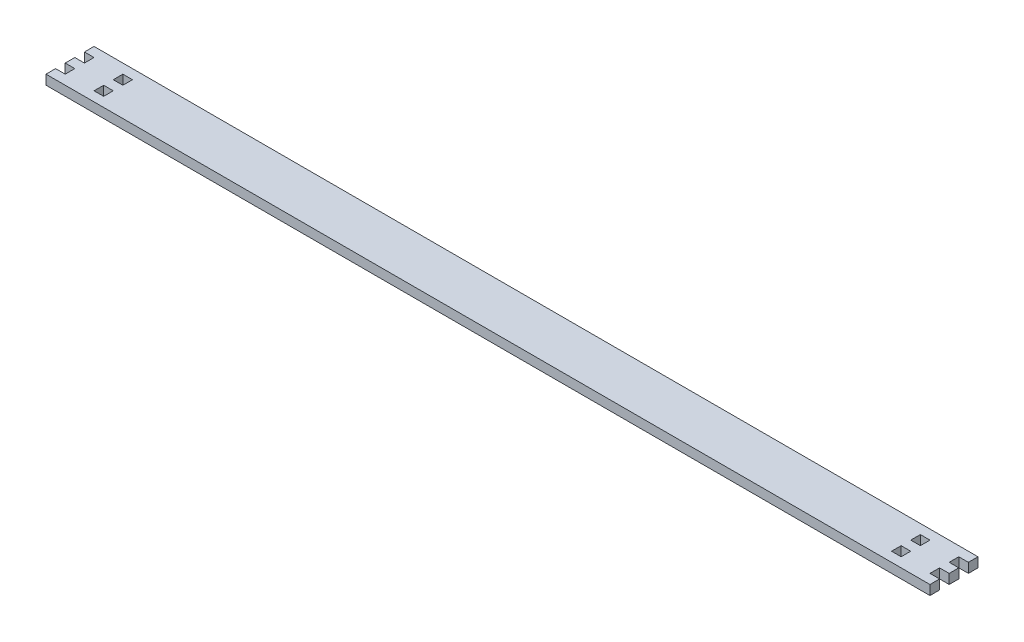
ISO-10303-21;
HEADER;
FILE_DESCRIPTION(('STEP AP214'),'2;1');
FILE_NAME('part.step','',(''),(''),'','','');
FILE_SCHEMA(('AUTOMOTIVE_DESIGN { 1 0 10303 214 1 1 1 1 }'));
ENDSEC;
DATA;
#1=APPLICATION_CONTEXT('core data for automotive mechanical design processes');
#2=APPLICATION_PROTOCOL_DEFINITION('international standard','automotive_design',2000,#1);
#3=PRODUCT_CONTEXT('',#1,'mechanical');
#4=PRODUCT('Part','Part','',(#3));
#5=PRODUCT_RELATED_PRODUCT_CATEGORY('part','',(#4));
#6=PRODUCT_DEFINITION_FORMATION('','',#4);
#7=PRODUCT_DEFINITION_CONTEXT('part definition',#1,'design');
#8=PRODUCT_DEFINITION('design','',#6,#7);
#9=PRODUCT_DEFINITION_SHAPE('','',#8);
#10=(LENGTH_UNIT() NAMED_UNIT(*) SI_UNIT(.MILLI.,.METRE.));
#11=(NAMED_UNIT(*) PLANE_ANGLE_UNIT() SI_UNIT($,.RADIAN.));
#12=(NAMED_UNIT(*) SI_UNIT($,.STERADIAN.) SOLID_ANGLE_UNIT());
#13=UNCERTAINTY_MEASURE_WITH_UNIT(LENGTH_MEASURE(1.E-05),#10,'distance_accuracy_value','');
#14=(GEOMETRIC_REPRESENTATION_CONTEXT(3) GLOBAL_UNCERTAINTY_ASSIGNED_CONTEXT((#13)) GLOBAL_UNIT_ASSIGNED_CONTEXT((#10,
#11,#12)) REPRESENTATION_CONTEXT('',''));
#15=CARTESIAN_POINT('',(0.,0.,0.));
#16=DIRECTION('',(0.,0.,1.));
#17=DIRECTION('',(1.,0.,0.));
#18=AXIS2_PLACEMENT_3D('',#15,#16,#17);
#19=CARTESIAN_POINT('',(0.,10.,0.));
#20=DIRECTION('',(0.,-1.,0.));
#21=DIRECTION('',(0.,0.,-1.));
#22=AXIS2_PLACEMENT_3D('',#19,#20,#21);
#23=PLANE('',#22);
#24=DIRECTION('',(-1.,0.,0.));
#25=VECTOR('',#24,1.);
#26=CARTESIAN_POINT('',(-410.,10.,5.));
#27=LINE('',#26,#25);
#28=CARTESIAN_POINT('',(-410.,10.,5.));
#29=VERTEX_POINT('',#28);
#30=CARTESIAN_POINT('',(-420.,10.,5.));
#31=VERTEX_POINT('',#30);
#32=EDGE_CURVE('E306',#29,#31,#27,.T.);
#33=ORIENTED_EDGE('',*,*,#32,.F.);
#34=DIRECTION('',(0.,0.,-1.));
#35=VECTOR('',#34,1.);
#36=CARTESIAN_POINT('',(-410.,10.,15.));
#37=LINE('',#36,#35);
#38=CARTESIAN_POINT('',(-410.,10.,15.));
#39=VERTEX_POINT('',#38);
#40=EDGE_CURVE('E314',#39,#29,#37,.T.);
#41=ORIENTED_EDGE('',*,*,#40,.F.);
#42=DIRECTION('',(1.,0.,0.));
#43=VECTOR('',#42,1.);
#44=CARTESIAN_POINT('',(-410.,10.,15.));
#45=LINE('',#44,#43);
#46=CARTESIAN_POINT('',(-420.,10.,15.));
#47=VERTEX_POINT('',#46);
#48=EDGE_CURVE('E311',#47,#39,#45,.T.);
#49=ORIENTED_EDGE('',*,*,#48,.F.);
#50=DIRECTION('',(0.,0.,1.));
#51=VECTOR('',#50,1.);
#52=CARTESIAN_POINT('',(-420.,10.,15.));
#53=LINE('',#52,#51);
#54=EDGE_CURVE('E308',#31,#47,#53,.T.);
#55=ORIENTED_EDGE('',*,*,#54,.F.);
#56=EDGE_LOOP('',(#33,#41,#49,#55));
#57=FACE_BOUND('',#56,.T.);
#58=DIRECTION('',(0.,0.,1.));
#59=VECTOR('',#58,1.);
#60=CARTESIAN_POINT('',(410.,10.,-5.));
#61=LINE('',#60,#59);
#62=CARTESIAN_POINT('',(410.,10.,-15.));
#63=VERTEX_POINT('',#62);
#64=CARTESIAN_POINT('',(410.,10.,-5.));
#65=VERTEX_POINT('',#64);
#66=EDGE_CURVE('E368',#63,#65,#61,.T.);
#67=ORIENTED_EDGE('',*,*,#66,.F.);
#68=DIRECTION('',(-1.,0.,0.));
#69=VECTOR('',#68,1.);
#70=CARTESIAN_POINT('',(410.,10.,-15.));
#71=LINE('',#70,#69);
#72=CARTESIAN_POINT('',(420.,10.,-15.));
#73=VERTEX_POINT('',#72);
#74=EDGE_CURVE('E376',#73,#63,#71,.T.);
#75=ORIENTED_EDGE('',*,*,#74,.F.);
#76=DIRECTION('',(0.,0.,-1.));
#77=VECTOR('',#76,1.);
#78=CARTESIAN_POINT('',(420.,10.,-15.));
#79=LINE('',#78,#77);
#80=CARTESIAN_POINT('',(420.,10.,-5.));
#81=VERTEX_POINT('',#80);
#82=EDGE_CURVE('E373',#81,#73,#79,.T.);
#83=ORIENTED_EDGE('',*,*,#82,.F.);
#84=DIRECTION('',(1.,0.,0.));
#85=VECTOR('',#84,1.);
#86=CARTESIAN_POINT('',(410.,10.,-5.));
#87=LINE('',#86,#85);
#88=EDGE_CURVE('E370',#65,#81,#87,.T.);
#89=ORIENTED_EDGE('',*,*,#88,.F.);
#90=EDGE_LOOP('',(#67,#75,#83,#89));
#91=FACE_BOUND('',#90,.T.);
#92=DIRECTION('',(-1.,0.,0.));
#93=VECTOR('',#92,1.);
#94=CARTESIAN_POINT('',(-450.,10.,-24.9999999999999));
#95=LINE('',#94,#93);
#96=CARTESIAN_POINT('',(460.,10.,-25.));
#97=VERTEX_POINT('',#96);
#98=CARTESIAN_POINT('',(-460.,10.,-25.));
#99=VERTEX_POINT('',#98);
#100=EDGE_CURVE('E399',#97,#99,#95,.T.);
#101=ORIENTED_EDGE('',*,*,#100,.T.);
#102=DIRECTION('',(0.,0.,1.));
#103=VECTOR('',#102,1.);
#104=CARTESIAN_POINT('',(-460.,10.,-15.));
#105=LINE('',#104,#103);
#106=CARTESIAN_POINT('',(-460.,10.,-15.));
#107=VERTEX_POINT('',#106);
#108=EDGE_CURVE('E402',#99,#107,#105,.T.);
#109=ORIENTED_EDGE('',*,*,#108,.T.);
#110=DIRECTION('',(1.,0.,0.));
#111=VECTOR('',#110,1.);
#112=CARTESIAN_POINT('',(-450.,10.,-15.));
#113=LINE('',#112,#111);
#114=CARTESIAN_POINT('',(-450.,10.,-15.));
#115=VERTEX_POINT('',#114);
#116=EDGE_CURVE('E405',#107,#115,#113,.T.);
#117=ORIENTED_EDGE('',*,*,#116,.T.);
#118=DIRECTION('',(0.,0.,1.));
#119=VECTOR('',#118,1.);
#120=CARTESIAN_POINT('',(-450.,10.,-5.));
#121=LINE('',#120,#119);
#122=CARTESIAN_POINT('',(-450.,10.,-5.));
#123=VERTEX_POINT('',#122);
#124=EDGE_CURVE('E407',#115,#123,#121,.T.);
#125=ORIENTED_EDGE('',*,*,#124,.T.);
#126=DIRECTION('',(-1.,0.,0.));
#127=VECTOR('',#126,1.);
#128=CARTESIAN_POINT('',(-450.,10.,-5.));
#129=LINE('',#128,#127);
#130=CARTESIAN_POINT('',(-460.,10.,-5.));
#131=VERTEX_POINT('',#130);
#132=EDGE_CURVE('E409',#123,#131,#129,.T.);
#133=ORIENTED_EDGE('',*,*,#132,.T.);
#134=DIRECTION('',(0.,0.,1.));
#135=VECTOR('',#134,1.);
#136=CARTESIAN_POINT('',(-460.,10.,5.));
#137=LINE('',#136,#135);
#138=CARTESIAN_POINT('',(-460.,10.,5.));
#139=VERTEX_POINT('',#138);
#140=EDGE_CURVE('E411',#131,#139,#137,.T.);
#141=ORIENTED_EDGE('',*,*,#140,.T.);
#142=DIRECTION('',(1.,0.,0.));
#143=VECTOR('',#142,1.);
#144=CARTESIAN_POINT('',(-450.,10.,5.));
#145=LINE('',#144,#143);
#146=CARTESIAN_POINT('',(-450.,10.,5.));
#147=VERTEX_POINT('',#146);
#148=EDGE_CURVE('E413',#139,#147,#145,.T.);
#149=ORIENTED_EDGE('',*,*,#148,.T.);
#150=DIRECTION('',(0.,0.,1.));
#151=VECTOR('',#150,1.);
#152=CARTESIAN_POINT('',(-450.,10.,15.));
#153=LINE('',#152,#151);
#154=CARTESIAN_POINT('',(-450.,10.,15.));
#155=VERTEX_POINT('',#154);
#156=EDGE_CURVE('E415',#147,#155,#153,.T.);
#157=ORIENTED_EDGE('',*,*,#156,.T.);
#158=DIRECTION('',(-1.,0.,0.));
#159=VECTOR('',#158,1.);
#160=CARTESIAN_POINT('',(-450.,10.,15.));
#161=LINE('',#160,#159);
#162=CARTESIAN_POINT('',(-460.,10.,15.));
#163=VERTEX_POINT('',#162);
#164=EDGE_CURVE('E417',#155,#163,#161,.T.);
#165=ORIENTED_EDGE('',*,*,#164,.T.);
#166=DIRECTION('',(0.,0.,1.));
#167=VECTOR('',#166,1.);
#168=CARTESIAN_POINT('',(-460.,10.,25.));
#169=LINE('',#168,#167);
#170=CARTESIAN_POINT('',(-460.,10.,25.));
#171=VERTEX_POINT('',#170);
#172=EDGE_CURVE('E419',#163,#171,#169,.T.);
#173=ORIENTED_EDGE('',*,*,#172,.T.);
#174=DIRECTION('',(1.,0.,0.));
#175=VECTOR('',#174,1.);
#176=CARTESIAN_POINT('',(-450.,10.,25.0000000000001));
#177=LINE('',#176,#175);
#178=CARTESIAN_POINT('',(460.,10.,25.));
#179=VERTEX_POINT('',#178);
#180=EDGE_CURVE('E421',#171,#179,#177,.T.);
#181=ORIENTED_EDGE('',*,*,#180,.T.);
#182=DIRECTION('',(0.,0.,-1.));
#183=VECTOR('',#182,1.);
#184=CARTESIAN_POINT('',(460.,10.,25.));
#185=LINE('',#184,#183);
#186=CARTESIAN_POINT('',(460.,10.,15.));
#187=VERTEX_POINT('',#186);
#188=EDGE_CURVE('E423',#179,#187,#185,.T.);
#189=ORIENTED_EDGE('',*,*,#188,.T.);
#190=DIRECTION('',(-1.,0.,0.));
#191=VECTOR('',#190,1.);
#192=CARTESIAN_POINT('',(450.,10.,15.));
#193=LINE('',#192,#191);
#194=CARTESIAN_POINT('',(450.,10.,15.));
#195=VERTEX_POINT('',#194);
#196=EDGE_CURVE('E425',#187,#195,#193,.T.);
#197=ORIENTED_EDGE('',*,*,#196,.T.);
#198=DIRECTION('',(0.,0.,-1.));
#199=VECTOR('',#198,1.);
#200=CARTESIAN_POINT('',(450.,10.,15.));
#201=LINE('',#200,#199);
#202=CARTESIAN_POINT('',(450.,10.,5.));
#203=VERTEX_POINT('',#202);
#204=EDGE_CURVE('E427',#195,#203,#201,.T.);
#205=ORIENTED_EDGE('',*,*,#204,.T.);
#206=DIRECTION('',(1.,0.,0.));
#207=VECTOR('',#206,1.);
#208=CARTESIAN_POINT('',(450.,10.,5.));
#209=LINE('',#208,#207);
#210=CARTESIAN_POINT('',(460.,10.,5.));
#211=VERTEX_POINT('',#210);
#212=EDGE_CURVE('E429',#203,#211,#209,.T.);
#213=ORIENTED_EDGE('',*,*,#212,.T.);
#214=DIRECTION('',(0.,0.,-1.));
#215=VECTOR('',#214,1.);
#216=CARTESIAN_POINT('',(460.,10.,5.));
#217=LINE('',#216,#215);
#218=CARTESIAN_POINT('',(460.,10.,-5.));
#219=VERTEX_POINT('',#218);
#220=EDGE_CURVE('E431',#211,#219,#217,.T.);
#221=ORIENTED_EDGE('',*,*,#220,.T.);
#222=DIRECTION('',(-1.,0.,0.));
#223=VECTOR('',#222,1.);
#224=CARTESIAN_POINT('',(450.,10.,-5.));
#225=LINE('',#224,#223);
#226=CARTESIAN_POINT('',(450.,10.,-5.));
#227=VERTEX_POINT('',#226);
#228=EDGE_CURVE('E433',#219,#227,#225,.T.);
#229=ORIENTED_EDGE('',*,*,#228,.T.);
#230=DIRECTION('',(0.,0.,-1.));
#231=VECTOR('',#230,1.);
#232=CARTESIAN_POINT('',(450.,10.,-5.));
#233=LINE('',#232,#231);
#234=CARTESIAN_POINT('',(450.,10.,-15.));
#235=VERTEX_POINT('',#234);
#236=EDGE_CURVE('E435',#227,#235,#233,.T.);
#237=ORIENTED_EDGE('',*,*,#236,.T.);
#238=DIRECTION('',(1.,0.,0.));
#239=VECTOR('',#238,1.);
#240=CARTESIAN_POINT('',(450.,10.,-15.));
#241=LINE('',#240,#239);
#242=CARTESIAN_POINT('',(460.,10.,-15.));
#243=VERTEX_POINT('',#242);
#244=EDGE_CURVE('E437',#235,#243,#241,.T.);
#245=ORIENTED_EDGE('',*,*,#244,.T.);
#246=DIRECTION('',(0.,0.,-1.));
#247=VECTOR('',#246,1.);
#248=CARTESIAN_POINT('',(460.,10.,-15.));
#249=LINE('',#248,#247);
#250=EDGE_CURVE('E439',#243,#97,#249,.T.);
#251=ORIENTED_EDGE('',*,*,#250,.T.);
#252=EDGE_LOOP('',(#101,#109,#117,#125,#133,#141,#149,#157,#165,#173,#181,#189,#197,#205,#213,
#221,#229,#237,#245,#251));
#253=FACE_BOUND('',#252,.T.);
#254=DIRECTION('',(1.,0.,0.));
#255=VECTOR('',#254,1.);
#256=CARTESIAN_POINT('',(-410.,10.,-5.));
#257=LINE('',#256,#255);
#258=CARTESIAN_POINT('',(-420.,10.,-5.));
#259=VERTEX_POINT('',#258);
#260=CARTESIAN_POINT('',(-410.,10.,-5.));
#261=VERTEX_POINT('',#260);
#262=EDGE_CURVE('E337',#259,#261,#257,.T.);
#263=ORIENTED_EDGE('',*,*,#262,.F.);
#264=DIRECTION('',(0.,0.,1.));
#265=VECTOR('',#264,1.);
#266=CARTESIAN_POINT('',(-420.,10.,-15.));
#267=LINE('',#266,#265);
#268=CARTESIAN_POINT('',(-420.,10.,-15.));
#269=VERTEX_POINT('',#268);
#270=EDGE_CURVE('E345',#269,#259,#267,.T.);
#271=ORIENTED_EDGE('',*,*,#270,.F.);
#272=DIRECTION('',(-1.,0.,0.));
#273=VECTOR('',#272,1.);
#274=CARTESIAN_POINT('',(-410.,10.,-15.));
#275=LINE('',#274,#273);
#276=CARTESIAN_POINT('',(-410.,10.,-15.));
#277=VERTEX_POINT('',#276);
#278=EDGE_CURVE('E342',#277,#269,#275,.T.);
#279=ORIENTED_EDGE('',*,*,#278,.F.);
#280=DIRECTION('',(0.,0.,-1.));
#281=VECTOR('',#280,1.);
#282=CARTESIAN_POINT('',(-410.,10.,-5.));
#283=LINE('',#282,#281);
#284=EDGE_CURVE('E339',#261,#277,#283,.T.);
#285=ORIENTED_EDGE('',*,*,#284,.F.);
#286=EDGE_LOOP('',(#263,#271,#279,#285));
#287=FACE_BOUND('',#286,.T.);
#288=DIRECTION('',(0.,0.,1.));
#289=VECTOR('',#288,1.);
#290=CARTESIAN_POINT('',(410.,10.,15.));
#291=LINE('',#290,#289);
#292=CARTESIAN_POINT('',(410.,10.,5.));
#293=VERTEX_POINT('',#292);
#294=CARTESIAN_POINT('',(410.,10.,15.));
#295=VERTEX_POINT('',#294);
#296=EDGE_CURVE('E270',#293,#295,#291,.T.);
#297=ORIENTED_EDGE('',*,*,#296,.F.);
#298=DIRECTION('',(-1.,0.,0.));
#299=VECTOR('',#298,1.);
#300=CARTESIAN_POINT('',(410.,10.,5.));
#301=LINE('',#300,#299);
#302=CARTESIAN_POINT('',(420.,10.,5.));
#303=VERTEX_POINT('',#302);
#304=EDGE_CURVE('E292',#303,#293,#301,.T.);
#305=ORIENTED_EDGE('',*,*,#304,.F.);
#306=DIRECTION('',(0.,0.,-1.));
#307=VECTOR('',#306,1.);
#308=CARTESIAN_POINT('',(420.,10.,15.));
#309=LINE('',#308,#307);
#310=CARTESIAN_POINT('',(420.,10.,15.));
#311=VERTEX_POINT('',#310);
#312=EDGE_CURVE('E290',#311,#303,#309,.T.);
#313=ORIENTED_EDGE('',*,*,#312,.F.);
#314=DIRECTION('',(1.,0.,0.));
#315=VECTOR('',#314,1.);
#316=CARTESIAN_POINT('',(410.,10.,15.));
#317=LINE('',#316,#315);
#318=EDGE_CURVE('E278',#295,#311,#317,.T.);
#319=ORIENTED_EDGE('',*,*,#318,.F.);
#320=EDGE_LOOP('',(#297,#305,#313,#319));
#321=FACE_BOUND('',#320,.T.);
#322=ADVANCED_FACE('F37',(#57,#91,#253,#287,#321),#23,.F.);
#323=CARTESIAN_POINT('',(0.,0.,0.));
#324=DIRECTION('',(0.,-1.,0.));
#325=DIRECTION('',(0.,0.,-1.));
#326=AXIS2_PLACEMENT_3D('',#323,#324,#325);
#327=PLANE('',#326);
#328=DIRECTION('',(0.,0.,1.));
#329=VECTOR('',#328,1.);
#330=CARTESIAN_POINT('',(-460.,0.,-15.));
#331=LINE('',#330,#329);
#332=CARTESIAN_POINT('',(-460.,0.,-25.));
#333=VERTEX_POINT('',#332);
#334=CARTESIAN_POINT('',(-460.,0.,-15.));
#335=VERTEX_POINT('',#334);
#336=EDGE_CURVE('E398',#333,#335,#331,.T.);
#337=ORIENTED_EDGE('',*,*,#336,.F.);
#338=DIRECTION('',(-1.,0.,0.));
#339=VECTOR('',#338,1.);
#340=CARTESIAN_POINT('',(450.,0.,-25.0000000000001));
#341=LINE('',#340,#339);
#342=CARTESIAN_POINT('',(460.,0.,-25.));
#343=VERTEX_POINT('',#342);
#344=EDGE_CURVE('E403',#343,#333,#341,.T.);
#345=ORIENTED_EDGE('',*,*,#344,.F.);
#346=DIRECTION('',(0.,0.,-1.));
#347=VECTOR('',#346,1.);
#348=CARTESIAN_POINT('',(460.,0.,-15.));
#349=LINE('',#348,#347);
#350=CARTESIAN_POINT('',(460.,0.,-15.));
#351=VERTEX_POINT('',#350);
#352=EDGE_CURVE('E479',#351,#343,#349,.T.);
#353=ORIENTED_EDGE('',*,*,#352,.F.);
#354=DIRECTION('',(1.,0.,0.));
#355=VECTOR('',#354,1.);
#356=CARTESIAN_POINT('',(450.,0.,-15.));
#357=LINE('',#356,#355);
#358=CARTESIAN_POINT('',(450.,0.,-15.));
#359=VERTEX_POINT('',#358);
#360=EDGE_CURVE('E477',#359,#351,#357,.T.);
#361=ORIENTED_EDGE('',*,*,#360,.F.);
#362=DIRECTION('',(0.,0.,-1.));
#363=VECTOR('',#362,1.);
#364=CARTESIAN_POINT('',(450.,0.,-5.));
#365=LINE('',#364,#363);
#366=CARTESIAN_POINT('',(450.,0.,-5.));
#367=VERTEX_POINT('',#366);
#368=EDGE_CURVE('E475',#367,#359,#365,.T.);
#369=ORIENTED_EDGE('',*,*,#368,.F.);
#370=DIRECTION('',(-1.,0.,0.));
#371=VECTOR('',#370,1.);
#372=CARTESIAN_POINT('',(450.,0.,-5.));
#373=LINE('',#372,#371);
#374=CARTESIAN_POINT('',(460.,0.,-5.));
#375=VERTEX_POINT('',#374);
#376=EDGE_CURVE('E473',#375,#367,#373,.T.);
#377=ORIENTED_EDGE('',*,*,#376,.F.);
#378=DIRECTION('',(0.,0.,-1.));
#379=VECTOR('',#378,1.);
#380=CARTESIAN_POINT('',(460.,0.,5.));
#381=LINE('',#380,#379);
#382=CARTESIAN_POINT('',(460.,0.,5.));
#383=VERTEX_POINT('',#382);
#384=EDGE_CURVE('E471',#383,#375,#381,.T.);
#385=ORIENTED_EDGE('',*,*,#384,.F.);
#386=DIRECTION('',(1.,0.,0.));
#387=VECTOR('',#386,1.);
#388=CARTESIAN_POINT('',(450.,0.,5.));
#389=LINE('',#388,#387);
#390=CARTESIAN_POINT('',(450.,0.,5.));
#391=VERTEX_POINT('',#390);
#392=EDGE_CURVE('E469',#391,#383,#389,.T.);
#393=ORIENTED_EDGE('',*,*,#392,.F.);
#394=DIRECTION('',(0.,0.,-1.));
#395=VECTOR('',#394,1.);
#396=CARTESIAN_POINT('',(450.,0.,15.));
#397=LINE('',#396,#395);
#398=CARTESIAN_POINT('',(450.,0.,15.));
#399=VERTEX_POINT('',#398);
#400=EDGE_CURVE('E467',#399,#391,#397,.T.);
#401=ORIENTED_EDGE('',*,*,#400,.F.);
#402=DIRECTION('',(-1.,0.,0.));
#403=VECTOR('',#402,1.);
#404=CARTESIAN_POINT('',(450.,0.,15.));
#405=LINE('',#404,#403);
#406=CARTESIAN_POINT('',(460.,0.,15.));
#407=VERTEX_POINT('',#406);
#408=EDGE_CURVE('E465',#407,#399,#405,.T.);
#409=ORIENTED_EDGE('',*,*,#408,.F.);
#410=DIRECTION('',(0.,0.,-1.));
#411=VECTOR('',#410,1.);
#412=CARTESIAN_POINT('',(460.,0.,25.));
#413=LINE('',#412,#411);
#414=CARTESIAN_POINT('',(460.,0.,25.));
#415=VERTEX_POINT('',#414);
#416=EDGE_CURVE('E463',#415,#407,#413,.T.);
#417=ORIENTED_EDGE('',*,*,#416,.F.);
#418=DIRECTION('',(1.,0.,0.));
#419=VECTOR('',#418,1.);
#420=CARTESIAN_POINT('',(460.,0.,25.));
#421=LINE('',#420,#419);
#422=CARTESIAN_POINT('',(-460.,0.,25.));
#423=VERTEX_POINT('',#422);
#424=EDGE_CURVE('E461',#423,#415,#421,.T.);
#425=ORIENTED_EDGE('',*,*,#424,.F.);
#426=DIRECTION('',(0.,0.,1.));
#427=VECTOR('',#426,1.);
#428=CARTESIAN_POINT('',(-460.,0.,25.));
#429=LINE('',#428,#427);
#430=CARTESIAN_POINT('',(-460.,0.,15.));
#431=VERTEX_POINT('',#430);
#432=EDGE_CURVE('E458',#431,#423,#429,.T.);
#433=ORIENTED_EDGE('',*,*,#432,.F.);
#434=DIRECTION('',(-1.,0.,0.));
#435=VECTOR('',#434,1.);
#436=CARTESIAN_POINT('',(-450.,0.,15.));
#437=LINE('',#436,#435);
#438=CARTESIAN_POINT('',(-450.,0.,15.));
#439=VERTEX_POINT('',#438);
#440=EDGE_CURVE('E456',#439,#431,#437,.T.);
#441=ORIENTED_EDGE('',*,*,#440,.F.);
#442=DIRECTION('',(0.,0.,1.));
#443=VECTOR('',#442,1.);
#444=CARTESIAN_POINT('',(-450.,0.,15.));
#445=LINE('',#444,#443);
#446=CARTESIAN_POINT('',(-450.,0.,5.));
#447=VERTEX_POINT('',#446);
#448=EDGE_CURVE('E454',#447,#439,#445,.T.);
#449=ORIENTED_EDGE('',*,*,#448,.F.);
#450=DIRECTION('',(1.,0.,0.));
#451=VECTOR('',#450,1.);
#452=CARTESIAN_POINT('',(-450.,0.,5.));
#453=LINE('',#452,#451);
#454=CARTESIAN_POINT('',(-460.,0.,5.));
#455=VERTEX_POINT('',#454);
#456=EDGE_CURVE('E452',#455,#447,#453,.T.);
#457=ORIENTED_EDGE('',*,*,#456,.F.);
#458=DIRECTION('',(0.,0.,1.));
#459=VECTOR('',#458,1.);
#460=CARTESIAN_POINT('',(-460.,0.,5.));
#461=LINE('',#460,#459);
#462=CARTESIAN_POINT('',(-460.,0.,-5.));
#463=VERTEX_POINT('',#462);
#464=EDGE_CURVE('E450',#463,#455,#461,.T.);
#465=ORIENTED_EDGE('',*,*,#464,.F.);
#466=DIRECTION('',(-1.,0.,0.));
#467=VECTOR('',#466,1.);
#468=CARTESIAN_POINT('',(-450.,0.,-5.));
#469=LINE('',#468,#467);
#470=CARTESIAN_POINT('',(-450.,0.,-5.));
#471=VERTEX_POINT('',#470);
#472=EDGE_CURVE('E448',#471,#463,#469,.T.);
#473=ORIENTED_EDGE('',*,*,#472,.F.);
#474=DIRECTION('',(0.,0.,1.));
#475=VECTOR('',#474,1.);
#476=CARTESIAN_POINT('',(-450.,0.,-5.));
#477=LINE('',#476,#475);
#478=CARTESIAN_POINT('',(-450.,0.,-15.));
#479=VERTEX_POINT('',#478);
#480=EDGE_CURVE('E446',#479,#471,#477,.T.);
#481=ORIENTED_EDGE('',*,*,#480,.F.);
#482=DIRECTION('',(1.,0.,0.));
#483=VECTOR('',#482,1.);
#484=CARTESIAN_POINT('',(-450.,0.,-15.));
#485=LINE('',#484,#483);
#486=EDGE_CURVE('E444',#335,#479,#485,.T.);
#487=ORIENTED_EDGE('',*,*,#486,.F.);
#488=EDGE_LOOP('',(#337,#345,#353,#361,#369,#377,#385,#393,#401,#409,#417,#425,#433,#441,#449,
#457,#465,#473,#481,#487));
#489=FACE_BOUND('',#488,.T.);
#490=DIRECTION('',(-1.,0.,0.));
#491=VECTOR('',#490,1.);
#492=CARTESIAN_POINT('',(410.,0.,-15.));
#493=LINE('',#492,#491);
#494=CARTESIAN_POINT('',(420.,0.,-15.));
#495=VERTEX_POINT('',#494);
#496=CARTESIAN_POINT('',(410.,0.,-15.));
#497=VERTEX_POINT('',#496);
#498=EDGE_CURVE('E371',#495,#497,#493,.T.);
#499=ORIENTED_EDGE('',*,*,#498,.T.);
#500=DIRECTION('',(0.,0.,1.));
#501=VECTOR('',#500,1.);
#502=CARTESIAN_POINT('',(410.,0.,-5.));
#503=LINE('',#502,#501);
#504=CARTESIAN_POINT('',(410.,0.,-5.));
#505=VERTEX_POINT('',#504);
#506=EDGE_CURVE('E367',#497,#505,#503,.T.);
#507=ORIENTED_EDGE('',*,*,#506,.T.);
#508=DIRECTION('',(1.,0.,0.));
#509=VECTOR('',#508,1.);
#510=CARTESIAN_POINT('',(410.,0.,-5.));
#511=LINE('',#510,#509);
#512=CARTESIAN_POINT('',(420.,0.,-5.));
#513=VERTEX_POINT('',#512);
#514=EDGE_CURVE('E381',#505,#513,#511,.T.);
#515=ORIENTED_EDGE('',*,*,#514,.T.);
#516=DIRECTION('',(0.,0.,-1.));
#517=VECTOR('',#516,1.);
#518=CARTESIAN_POINT('',(420.,0.,-15.));
#519=LINE('',#518,#517);
#520=EDGE_CURVE('E384',#513,#495,#519,.T.);
#521=ORIENTED_EDGE('',*,*,#520,.T.);
#522=EDGE_LOOP('',(#499,#507,#515,#521));
#523=FACE_BOUND('',#522,.T.);
#524=DIRECTION('',(0.,0.,1.));
#525=VECTOR('',#524,1.);
#526=CARTESIAN_POINT('',(-420.,0.,-15.));
#527=LINE('',#526,#525);
#528=CARTESIAN_POINT('',(-420.,0.,-15.));
#529=VERTEX_POINT('',#528);
#530=CARTESIAN_POINT('',(-420.,0.,-5.));
#531=VERTEX_POINT('',#530);
#532=EDGE_CURVE('E340',#529,#531,#527,.T.);
#533=ORIENTED_EDGE('',*,*,#532,.T.);
#534=DIRECTION('',(1.,0.,0.));
#535=VECTOR('',#534,1.);
#536=CARTESIAN_POINT('',(-410.,0.,-5.));
#537=LINE('',#536,#535);
#538=CARTESIAN_POINT('',(-410.,0.,-5.));
#539=VERTEX_POINT('',#538);
#540=EDGE_CURVE('E336',#531,#539,#537,.T.);
#541=ORIENTED_EDGE('',*,*,#540,.T.);
#542=DIRECTION('',(0.,0.,-1.));
#543=VECTOR('',#542,1.);
#544=CARTESIAN_POINT('',(-410.,0.,-5.));
#545=LINE('',#544,#543);
#546=CARTESIAN_POINT('',(-410.,0.,-15.));
#547=VERTEX_POINT('',#546);
#548=EDGE_CURVE('E350',#539,#547,#545,.T.);
#549=ORIENTED_EDGE('',*,*,#548,.T.);
#550=DIRECTION('',(-1.,0.,0.));
#551=VECTOR('',#550,1.);
#552=CARTESIAN_POINT('',(-410.,0.,-15.));
#553=LINE('',#552,#551);
#554=EDGE_CURVE('E353',#547,#529,#553,.T.);
#555=ORIENTED_EDGE('',*,*,#554,.T.);
#556=EDGE_LOOP('',(#533,#541,#549,#555));
#557=FACE_BOUND('',#556,.T.);
#558=DIRECTION('',(0.,0.,-1.));
#559=VECTOR('',#558,1.);
#560=CARTESIAN_POINT('',(-410.,0.,15.));
#561=LINE('',#560,#559);
#562=CARTESIAN_POINT('',(-410.,0.,15.));
#563=VERTEX_POINT('',#562);
#564=CARTESIAN_POINT('',(-410.,0.,5.));
#565=VERTEX_POINT('',#564);
#566=EDGE_CURVE('E309',#563,#565,#561,.T.);
#567=ORIENTED_EDGE('',*,*,#566,.T.);
#568=DIRECTION('',(-1.,0.,0.));
#569=VECTOR('',#568,1.);
#570=CARTESIAN_POINT('',(-410.,0.,5.));
#571=LINE('',#570,#569);
#572=CARTESIAN_POINT('',(-420.,0.,5.));
#573=VERTEX_POINT('',#572);
#574=EDGE_CURVE('E286',#565,#573,#571,.T.);
#575=ORIENTED_EDGE('',*,*,#574,.T.);
#576=DIRECTION('',(0.,0.,1.));
#577=VECTOR('',#576,1.);
#578=CARTESIAN_POINT('',(-420.,0.,15.));
#579=LINE('',#578,#577);
#580=CARTESIAN_POINT('',(-420.,0.,15.));
#581=VERTEX_POINT('',#580);
#582=EDGE_CURVE('E319',#573,#581,#579,.T.);
#583=ORIENTED_EDGE('',*,*,#582,.T.);
#584=DIRECTION('',(1.,0.,0.));
#585=VECTOR('',#584,1.);
#586=CARTESIAN_POINT('',(-410.,0.,15.));
#587=LINE('',#586,#585);
#588=EDGE_CURVE('E322',#581,#563,#587,.T.);
#589=ORIENTED_EDGE('',*,*,#588,.T.);
#590=EDGE_LOOP('',(#567,#575,#583,#589));
#591=FACE_BOUND('',#590,.T.);
#592=DIRECTION('',(-1.,0.,0.));
#593=VECTOR('',#592,1.);
#594=CARTESIAN_POINT('',(410.,0.,5.));
#595=LINE('',#594,#593);
#596=CARTESIAN_POINT('',(420.,0.,5.));
#597=VERTEX_POINT('',#596);
#598=CARTESIAN_POINT('',(410.,0.,5.));
#599=VERTEX_POINT('',#598);
#600=EDGE_CURVE('E279',#597,#599,#595,.T.);
#601=ORIENTED_EDGE('',*,*,#600,.T.);
#602=DIRECTION('',(0.,0.,1.));
#603=VECTOR('',#602,1.);
#604=CARTESIAN_POINT('',(410.,0.,15.));
#605=LINE('',#604,#603);
#606=CARTESIAN_POINT('',(410.,0.,15.));
#607=VERTEX_POINT('',#606);
#608=EDGE_CURVE('E60',#599,#607,#605,.T.);
#609=ORIENTED_EDGE('',*,*,#608,.T.);
#610=DIRECTION('',(1.,0.,0.));
#611=VECTOR('',#610,1.);
#612=CARTESIAN_POINT('',(410.,0.,15.));
#613=LINE('',#612,#611);
#614=CARTESIAN_POINT('',(420.,0.,15.));
#615=VERTEX_POINT('',#614);
#616=EDGE_CURVE('E285',#607,#615,#613,.T.);
#617=ORIENTED_EDGE('',*,*,#616,.T.);
#618=DIRECTION('',(0.,0.,-1.));
#619=VECTOR('',#618,1.);
#620=CARTESIAN_POINT('',(420.,0.,15.));
#621=LINE('',#620,#619);
#622=EDGE_CURVE('E298',#615,#597,#621,.T.);
#623=ORIENTED_EDGE('',*,*,#622,.T.);
#624=EDGE_LOOP('',(#601,#609,#617,#623));
#625=FACE_BOUND('',#624,.T.);
#626=ADVANCED_FACE('F546',(#489,#523,#557,#591,#625),#327,.T.);
#627=CARTESIAN_POINT('',(-460.,10.,-15.));
#628=DIRECTION('',(1.,0.,0.));
#629=DIRECTION('',(0.,0.,-1.));
#630=AXIS2_PLACEMENT_3D('',#627,#628,#629);
#631=PLANE('',#630);
#632=ORIENTED_EDGE('',*,*,#336,.T.);
#633=DIRECTION('',(0.,-1.,0.));
#634=VECTOR('',#633,1.);
#635=CARTESIAN_POINT('',(-460.,10.,-15.));
#636=LINE('',#635,#634);
#637=EDGE_CURVE('E45',#107,#335,#636,.T.);
#638=ORIENTED_EDGE('',*,*,#637,.F.);
#639=ORIENTED_EDGE('',*,*,#108,.F.);
#640=DIRECTION('',(0.,-1.,0.));
#641=VECTOR('',#640,1.);
#642=CARTESIAN_POINT('',(-460.,10.,-25.));
#643=LINE('',#642,#641);
#644=EDGE_CURVE('E11',#99,#333,#643,.T.);
#645=ORIENTED_EDGE('',*,*,#644,.T.);
#646=EDGE_LOOP('',(#632,#638,#639,#645));
#647=FACE_BOUND('',#646,.T.);
#648=ADVANCED_FACE('F39',(#647),#631,.F.);
#649=CARTESIAN_POINT('',(-450.,10.,-15.));
#650=DIRECTION('',(0.,0.,-1.));
#651=DIRECTION('',(-1.,0.,0.));
#652=AXIS2_PLACEMENT_3D('',#649,#650,#651);
#653=PLANE('',#652);
#654=ORIENTED_EDGE('',*,*,#486,.T.);
#655=DIRECTION('',(0.,-1.,0.));
#656=VECTOR('',#655,1.);
#657=CARTESIAN_POINT('',(-450.,10.,-15.));
#658=LINE('',#657,#656);
#659=EDGE_CURVE('E533',#115,#479,#658,.T.);
#660=ORIENTED_EDGE('',*,*,#659,.F.);
#661=ORIENTED_EDGE('',*,*,#116,.F.);
#662=ORIENTED_EDGE('',*,*,#637,.T.);
#663=EDGE_LOOP('',(#654,#660,#661,#662));
#664=FACE_BOUND('',#663,.T.);
#665=ADVANCED_FACE('F540',(#664),#653,.F.);
#666=CARTESIAN_POINT('',(-450.,10.,-5.));
#667=DIRECTION('',(1.,0.,0.));
#668=DIRECTION('',(0.,0.,-1.));
#669=AXIS2_PLACEMENT_3D('',#666,#667,#668);
#670=PLANE('',#669);
#671=ORIENTED_EDGE('',*,*,#480,.T.);
#672=DIRECTION('',(0.,-1.,0.));
#673=VECTOR('',#672,1.);
#674=CARTESIAN_POINT('',(-450.,10.,-5.));
#675=LINE('',#674,#673);
#676=EDGE_CURVE('E530',#123,#471,#675,.T.);
#677=ORIENTED_EDGE('',*,*,#676,.F.);
#678=ORIENTED_EDGE('',*,*,#124,.F.);
#679=ORIENTED_EDGE('',*,*,#659,.T.);
#680=EDGE_LOOP('',(#671,#677,#678,#679));
#681=FACE_BOUND('',#680,.T.);
#682=ADVANCED_FACE('F552',(#681),#670,.F.);
#683=CARTESIAN_POINT('',(-450.,10.,-5.));
#684=DIRECTION('',(0.,0.,1.));
#685=DIRECTION('',(1.,0.,0.));
#686=AXIS2_PLACEMENT_3D('',#683,#684,#685);
#687=PLANE('',#686);
#688=ORIENTED_EDGE('',*,*,#472,.T.);
#689=DIRECTION('',(0.,-1.,0.));
#690=VECTOR('',#689,1.);
#691=CARTESIAN_POINT('',(-460.,10.,-5.));
#692=LINE('',#691,#690);
#693=EDGE_CURVE('E527',#131,#463,#692,.T.);
#694=ORIENTED_EDGE('',*,*,#693,.F.);
#695=ORIENTED_EDGE('',*,*,#132,.F.);
#696=ORIENTED_EDGE('',*,*,#676,.T.);
#697=EDGE_LOOP('',(#688,#694,#695,#696));
#698=FACE_BOUND('',#697,.T.);
#699=ADVANCED_FACE('F556',(#698),#687,.F.);
#700=CARTESIAN_POINT('',(-460.,10.,5.));
#701=DIRECTION('',(1.,0.,0.));
#702=DIRECTION('',(0.,0.,-1.));
#703=AXIS2_PLACEMENT_3D('',#700,#701,#702);
#704=PLANE('',#703);
#705=ORIENTED_EDGE('',*,*,#464,.T.);
#706=DIRECTION('',(0.,-1.,0.));
#707=VECTOR('',#706,1.);
#708=CARTESIAN_POINT('',(-460.,10.,5.));
#709=LINE('',#708,#707);
#710=EDGE_CURVE('E524',#139,#455,#709,.T.);
#711=ORIENTED_EDGE('',*,*,#710,.F.);
#712=ORIENTED_EDGE('',*,*,#140,.F.);
#713=ORIENTED_EDGE('',*,*,#693,.T.);
#714=EDGE_LOOP('',(#705,#711,#712,#713));
#715=FACE_BOUND('',#714,.T.);
#716=ADVANCED_FACE('F635',(#715),#704,.F.);
#717=CARTESIAN_POINT('',(-450.,10.,5.));
#718=DIRECTION('',(0.,0.,-1.));
#719=DIRECTION('',(-1.,0.,0.));
#720=AXIS2_PLACEMENT_3D('',#717,#718,#719);
#721=PLANE('',#720);
#722=ORIENTED_EDGE('',*,*,#456,.T.);
#723=DIRECTION('',(0.,-1.,0.));
#724=VECTOR('',#723,1.);
#725=CARTESIAN_POINT('',(-450.,10.,5.));
#726=LINE('',#725,#724);
#727=EDGE_CURVE('E521',#147,#447,#726,.T.);
#728=ORIENTED_EDGE('',*,*,#727,.F.);
#729=ORIENTED_EDGE('',*,*,#148,.F.);
#730=ORIENTED_EDGE('',*,*,#710,.T.);
#731=EDGE_LOOP('',(#722,#728,#729,#730));
#732=FACE_BOUND('',#731,.T.);
#733=ADVANCED_FACE('F633',(#732),#721,.F.);
#734=CARTESIAN_POINT('',(-450.,10.,15.));
#735=DIRECTION('',(1.,0.,0.));
#736=DIRECTION('',(0.,0.,-1.));
#737=AXIS2_PLACEMENT_3D('',#734,#735,#736);
#738=PLANE('',#737);
#739=ORIENTED_EDGE('',*,*,#448,.T.);
#740=DIRECTION('',(0.,-1.,0.));
#741=VECTOR('',#740,1.);
#742=CARTESIAN_POINT('',(-450.,10.,15.));
#743=LINE('',#742,#741);
#744=EDGE_CURVE('E518',#155,#439,#743,.T.);
#745=ORIENTED_EDGE('',*,*,#744,.F.);
#746=ORIENTED_EDGE('',*,*,#156,.F.);
#747=ORIENTED_EDGE('',*,*,#727,.T.);
#748=EDGE_LOOP('',(#739,#745,#746,#747));
#749=FACE_BOUND('',#748,.T.);
#750=ADVANCED_FACE('F629',(#749),#738,.F.);
#751=CARTESIAN_POINT('',(-450.,10.,15.));
#752=DIRECTION('',(0.,0.,1.));
#753=DIRECTION('',(1.,0.,0.));
#754=AXIS2_PLACEMENT_3D('',#751,#752,#753);
#755=PLANE('',#754);
#756=ORIENTED_EDGE('',*,*,#440,.T.);
#757=DIRECTION('',(0.,-1.,0.));
#758=VECTOR('',#757,1.);
#759=CARTESIAN_POINT('',(-460.,10.,15.));
#760=LINE('',#759,#758);
#761=EDGE_CURVE('E515',#163,#431,#760,.T.);
#762=ORIENTED_EDGE('',*,*,#761,.F.);
#763=ORIENTED_EDGE('',*,*,#164,.F.);
#764=ORIENTED_EDGE('',*,*,#744,.T.);
#765=EDGE_LOOP('',(#756,#762,#763,#764));
#766=FACE_BOUND('',#765,.T.);
#767=ADVANCED_FACE('F624',(#766),#755,.F.);
#768=CARTESIAN_POINT('',(-460.,10.,25.));
#769=DIRECTION('',(1.,0.,0.));
#770=DIRECTION('',(0.,0.,-1.));
#771=AXIS2_PLACEMENT_3D('',#768,#769,#770);
#772=PLANE('',#771);
#773=ORIENTED_EDGE('',*,*,#432,.T.);
#774=DIRECTION('',(0.,-1.,0.));
#775=VECTOR('',#774,1.);
#776=CARTESIAN_POINT('',(-460.,10.,25.));
#777=LINE('',#776,#775);
#778=EDGE_CURVE('E512',#171,#423,#777,.T.);
#779=ORIENTED_EDGE('',*,*,#778,.F.);
#780=ORIENTED_EDGE('',*,*,#172,.F.);
#781=ORIENTED_EDGE('',*,*,#761,.T.);
#782=EDGE_LOOP('',(#773,#779,#780,#781));
#783=FACE_BOUND('',#782,.T.);
#784=ADVANCED_FACE('F618',(#783),#772,.F.);
#785=CARTESIAN_POINT('',(460.,10.,25.));
#786=DIRECTION('',(0.,0.,-1.));
#787=DIRECTION('',(-1.,0.,0.));
#788=AXIS2_PLACEMENT_3D('',#785,#786,#787);
#789=PLANE('',#788);
#790=ORIENTED_EDGE('',*,*,#424,.T.);
#791=DIRECTION('',(0.,-1.,0.));
#792=VECTOR('',#791,1.);
#793=CARTESIAN_POINT('',(460.,10.,25.));
#794=LINE('',#793,#792);
#795=EDGE_CURVE('E509',#179,#415,#794,.T.);
#796=ORIENTED_EDGE('',*,*,#795,.F.);
#797=ORIENTED_EDGE('',*,*,#180,.F.);
#798=ORIENTED_EDGE('',*,*,#778,.T.);
#799=EDGE_LOOP('',(#790,#796,#797,#798));
#800=FACE_BOUND('',#799,.T.);
#801=ADVANCED_FACE('F614',(#800),#789,.F.);
#802=CARTESIAN_POINT('',(460.,10.,25.));
#803=DIRECTION('',(-1.,0.,0.));
#804=DIRECTION('',(0.,0.,1.));
#805=AXIS2_PLACEMENT_3D('',#802,#803,#804);
#806=PLANE('',#805);
#807=ORIENTED_EDGE('',*,*,#416,.T.);
#808=DIRECTION('',(0.,-1.,0.));
#809=VECTOR('',#808,1.);
#810=CARTESIAN_POINT('',(460.,10.,15.));
#811=LINE('',#810,#809);
#812=EDGE_CURVE('E506',#187,#407,#811,.T.);
#813=ORIENTED_EDGE('',*,*,#812,.F.);
#814=ORIENTED_EDGE('',*,*,#188,.F.);
#815=ORIENTED_EDGE('',*,*,#795,.T.);
#816=EDGE_LOOP('',(#807,#813,#814,#815));
#817=FACE_BOUND('',#816,.T.);
#818=ADVANCED_FACE('F609',(#817),#806,.F.);
#819=CARTESIAN_POINT('',(450.,10.,15.));
#820=DIRECTION('',(0.,0.,1.));
#821=DIRECTION('',(1.,0.,0.));
#822=AXIS2_PLACEMENT_3D('',#819,#820,#821);
#823=PLANE('',#822);
#824=ORIENTED_EDGE('',*,*,#408,.T.);
#825=DIRECTION('',(0.,-1.,0.));
#826=VECTOR('',#825,1.);
#827=CARTESIAN_POINT('',(450.,10.,15.));
#828=LINE('',#827,#826);
#829=EDGE_CURVE('E503',#195,#399,#828,.T.);
#830=ORIENTED_EDGE('',*,*,#829,.F.);
#831=ORIENTED_EDGE('',*,*,#196,.F.);
#832=ORIENTED_EDGE('',*,*,#812,.T.);
#833=EDGE_LOOP('',(#824,#830,#831,#832));
#834=FACE_BOUND('',#833,.T.);
#835=ADVANCED_FACE('F604',(#834),#823,.F.);
#836=CARTESIAN_POINT('',(450.,10.,15.));
#837=DIRECTION('',(-1.,0.,0.));
#838=DIRECTION('',(0.,0.,1.));
#839=AXIS2_PLACEMENT_3D('',#836,#837,#838);
#840=PLANE('',#839);
#841=ORIENTED_EDGE('',*,*,#400,.T.);
#842=DIRECTION('',(0.,-1.,0.));
#843=VECTOR('',#842,1.);
#844=CARTESIAN_POINT('',(450.,10.,5.));
#845=LINE('',#844,#843);
#846=EDGE_CURVE('E500',#203,#391,#845,.T.);
#847=ORIENTED_EDGE('',*,*,#846,.F.);
#848=ORIENTED_EDGE('',*,*,#204,.F.);
#849=ORIENTED_EDGE('',*,*,#829,.T.);
#850=EDGE_LOOP('',(#841,#847,#848,#849));
#851=FACE_BOUND('',#850,.T.);
#852=ADVANCED_FACE('F600',(#851),#840,.F.);
#853=CARTESIAN_POINT('',(450.,10.,5.));
#854=DIRECTION('',(0.,0.,-1.));
#855=DIRECTION('',(-1.,0.,0.));
#856=AXIS2_PLACEMENT_3D('',#853,#854,#855);
#857=PLANE('',#856);
#858=ORIENTED_EDGE('',*,*,#392,.T.);
#859=DIRECTION('',(0.,-1.,0.));
#860=VECTOR('',#859,1.);
#861=CARTESIAN_POINT('',(460.,10.,5.));
#862=LINE('',#861,#860);
#863=EDGE_CURVE('E497',#211,#383,#862,.T.);
#864=ORIENTED_EDGE('',*,*,#863,.F.);
#865=ORIENTED_EDGE('',*,*,#212,.F.);
#866=ORIENTED_EDGE('',*,*,#846,.T.);
#867=EDGE_LOOP('',(#858,#864,#865,#866));
#868=FACE_BOUND('',#867,.T.);
#869=ADVANCED_FACE('F595',(#868),#857,.F.);
#870=CARTESIAN_POINT('',(460.,10.,5.));
#871=DIRECTION('',(-1.,0.,0.));
#872=DIRECTION('',(0.,0.,1.));
#873=AXIS2_PLACEMENT_3D('',#870,#871,#872);
#874=PLANE('',#873);
#875=ORIENTED_EDGE('',*,*,#384,.T.);
#876=DIRECTION('',(0.,-1.,0.));
#877=VECTOR('',#876,1.);
#878=CARTESIAN_POINT('',(460.,10.,-5.));
#879=LINE('',#878,#877);
#880=EDGE_CURVE('E494',#219,#375,#879,.T.);
#881=ORIENTED_EDGE('',*,*,#880,.F.);
#882=ORIENTED_EDGE('',*,*,#220,.F.);
#883=ORIENTED_EDGE('',*,*,#863,.T.);
#884=EDGE_LOOP('',(#875,#881,#882,#883));
#885=FACE_BOUND('',#884,.T.);
#886=ADVANCED_FACE('F589',(#885),#874,.F.);
#887=CARTESIAN_POINT('',(450.,10.,-5.));
#888=DIRECTION('',(0.,0.,1.));
#889=DIRECTION('',(1.,0.,0.));
#890=AXIS2_PLACEMENT_3D('',#887,#888,#889);
#891=PLANE('',#890);
#892=ORIENTED_EDGE('',*,*,#376,.T.);
#893=DIRECTION('',(0.,-1.,0.));
#894=VECTOR('',#893,1.);
#895=CARTESIAN_POINT('',(450.,10.,-5.));
#896=LINE('',#895,#894);
#897=EDGE_CURVE('E491',#227,#367,#896,.T.);
#898=ORIENTED_EDGE('',*,*,#897,.F.);
#899=ORIENTED_EDGE('',*,*,#228,.F.);
#900=ORIENTED_EDGE('',*,*,#880,.T.);
#901=EDGE_LOOP('',(#892,#898,#899,#900));
#902=FACE_BOUND('',#901,.T.);
#903=ADVANCED_FACE('F585',(#902),#891,.F.);
#904=CARTESIAN_POINT('',(450.,10.,-5.));
#905=DIRECTION('',(-1.,0.,0.));
#906=DIRECTION('',(0.,0.,1.));
#907=AXIS2_PLACEMENT_3D('',#904,#905,#906);
#908=PLANE('',#907);
#909=ORIENTED_EDGE('',*,*,#368,.T.);
#910=DIRECTION('',(0.,-1.,0.));
#911=VECTOR('',#910,1.);
#912=CARTESIAN_POINT('',(450.,10.,-15.));
#913=LINE('',#912,#911);
#914=EDGE_CURVE('E488',#235,#359,#913,.T.);
#915=ORIENTED_EDGE('',*,*,#914,.F.);
#916=ORIENTED_EDGE('',*,*,#236,.F.);
#917=ORIENTED_EDGE('',*,*,#897,.T.);
#918=EDGE_LOOP('',(#909,#915,#916,#917));
#919=FACE_BOUND('',#918,.T.);
#920=ADVANCED_FACE('F580',(#919),#908,.F.);
#921=CARTESIAN_POINT('',(450.,10.,-15.));
#922=DIRECTION('',(0.,0.,-1.));
#923=DIRECTION('',(-1.,0.,0.));
#924=AXIS2_PLACEMENT_3D('',#921,#922,#923);
#925=PLANE('',#924);
#926=ORIENTED_EDGE('',*,*,#360,.T.);
#927=DIRECTION('',(0.,-1.,0.));
#928=VECTOR('',#927,1.);
#929=CARTESIAN_POINT('',(460.,10.,-15.));
#930=LINE('',#929,#928);
#931=EDGE_CURVE('E485',#243,#351,#930,.T.);
#932=ORIENTED_EDGE('',*,*,#931,.F.);
#933=ORIENTED_EDGE('',*,*,#244,.F.);
#934=ORIENTED_EDGE('',*,*,#914,.T.);
#935=EDGE_LOOP('',(#926,#932,#933,#934));
#936=FACE_BOUND('',#935,.T.);
#937=ADVANCED_FACE('F574',(#936),#925,.F.);
#938=CARTESIAN_POINT('',(460.,10.,-15.));
#939=DIRECTION('',(-1.,0.,0.));
#940=DIRECTION('',(0.,0.,1.));
#941=AXIS2_PLACEMENT_3D('',#938,#939,#940);
#942=PLANE('',#941);
#943=ORIENTED_EDGE('',*,*,#352,.T.);
#944=DIRECTION('',(0.,-1.,0.));
#945=VECTOR('',#944,1.);
#946=CARTESIAN_POINT('',(460.,10.,-25.));
#947=LINE('',#946,#945);
#948=EDGE_CURVE('E442',#97,#343,#947,.T.);
#949=ORIENTED_EDGE('',*,*,#948,.F.);
#950=ORIENTED_EDGE('',*,*,#250,.F.);
#951=ORIENTED_EDGE('',*,*,#931,.T.);
#952=EDGE_LOOP('',(#943,#949,#950,#951));
#953=FACE_BOUND('',#952,.T.);
#954=ADVANCED_FACE('F569',(#953),#942,.F.);
#955=CARTESIAN_POINT('',(450.,10.,-25.0000000000001));
#956=DIRECTION('',(0.,0.,1.));
#957=DIRECTION('',(1.,0.,0.));
#958=AXIS2_PLACEMENT_3D('',#955,#956,#957);
#959=PLANE('',#958);
#960=ORIENTED_EDGE('',*,*,#344,.T.);
#961=ORIENTED_EDGE('',*,*,#644,.F.);
#962=ORIENTED_EDGE('',*,*,#100,.F.);
#963=ORIENTED_EDGE('',*,*,#948,.T.);
#964=EDGE_LOOP('',(#960,#961,#962,#963));
#965=FACE_BOUND('',#964,.T.);
#966=ADVANCED_FACE('F564',(#965),#959,.F.);
#967=CARTESIAN_POINT('',(410.,10.,-5.));
#968=DIRECTION('',(1.,0.,0.));
#969=DIRECTION('',(0.,0.,-1.));
#970=AXIS2_PLACEMENT_3D('',#967,#968,#969);
#971=PLANE('',#970);
#972=ORIENTED_EDGE('',*,*,#506,.F.);
#973=DIRECTION('',(0.,-1.,0.));
#974=VECTOR('',#973,1.);
#975=CARTESIAN_POINT('',(410.,10.,-15.));
#976=LINE('',#975,#974);
#977=EDGE_CURVE('E378',#63,#497,#976,.T.);
#978=ORIENTED_EDGE('',*,*,#977,.F.);
#979=ORIENTED_EDGE('',*,*,#66,.T.);
#980=DIRECTION('',(0.,-1.,0.));
#981=VECTOR('',#980,1.);
#982=CARTESIAN_POINT('',(410.,10.,-5.));
#983=LINE('',#982,#981);
#984=EDGE_CURVE('E395',#65,#505,#983,.T.);
#985=ORIENTED_EDGE('',*,*,#984,.T.);
#986=EDGE_LOOP('',(#972,#978,#979,#985));
#987=FACE_BOUND('',#986,.T.);
#988=ADVANCED_FACE('F654',(#987),#971,.T.);
#989=CARTESIAN_POINT('',(410.,10.,-5.));
#990=DIRECTION('',(0.,0.,-1.));
#991=DIRECTION('',(-1.,0.,0.));
#992=AXIS2_PLACEMENT_3D('',#989,#990,#991);
#993=PLANE('',#992);
#994=ORIENTED_EDGE('',*,*,#514,.F.);
#995=ORIENTED_EDGE('',*,*,#984,.F.);
#996=ORIENTED_EDGE('',*,*,#88,.T.);
#997=DIRECTION('',(0.,-1.,0.));
#998=VECTOR('',#997,1.);
#999=CARTESIAN_POINT('',(420.,10.,-5.));
#1000=LINE('',#999,#998);
#1001=EDGE_CURVE('E393',#81,#513,#1000,.T.);
#1002=ORIENTED_EDGE('',*,*,#1001,.T.);
#1003=EDGE_LOOP('',(#994,#995,#996,#1002));
#1004=FACE_BOUND('',#1003,.T.);
#1005=ADVANCED_FACE('F746',(#1004),#993,.T.);
#1006=CARTESIAN_POINT('',(420.,10.,-15.));
#1007=DIRECTION('',(-1.,0.,0.));
#1008=DIRECTION('',(0.,0.,1.));
#1009=AXIS2_PLACEMENT_3D('',#1006,#1007,#1008);
#1010=PLANE('',#1009);
#1011=ORIENTED_EDGE('',*,*,#520,.F.);
#1012=ORIENTED_EDGE('',*,*,#1001,.F.);
#1013=ORIENTED_EDGE('',*,*,#82,.T.);
#1014=DIRECTION('',(0.,-1.,0.));
#1015=VECTOR('',#1014,1.);
#1016=CARTESIAN_POINT('',(420.,10.,-15.));
#1017=LINE('',#1016,#1015);
#1018=EDGE_CURVE('E391',#73,#495,#1017,.T.);
#1019=ORIENTED_EDGE('',*,*,#1018,.T.);
#1020=EDGE_LOOP('',(#1011,#1012,#1013,#1019));
#1021=FACE_BOUND('',#1020,.T.);
#1022=ADVANCED_FACE('F753',(#1021),#1010,.T.);
#1023=CARTESIAN_POINT('',(410.,10.,-15.));
#1024=DIRECTION('',(0.,0.,1.));
#1025=DIRECTION('',(1.,0.,0.));
#1026=AXIS2_PLACEMENT_3D('',#1023,#1024,#1025);
#1027=PLANE('',#1026);
#1028=ORIENTED_EDGE('',*,*,#498,.F.);
#1029=ORIENTED_EDGE('',*,*,#1018,.F.);
#1030=ORIENTED_EDGE('',*,*,#74,.T.);
#1031=ORIENTED_EDGE('',*,*,#977,.T.);
#1032=EDGE_LOOP('',(#1028,#1029,#1030,#1031));
#1033=FACE_BOUND('',#1032,.T.);
#1034=ADVANCED_FACE('F760',(#1033),#1027,.T.);
#1035=CARTESIAN_POINT('',(-410.,10.,-5.));
#1036=DIRECTION('',(0.,0.,-1.));
#1037=DIRECTION('',(-1.,0.,0.));
#1038=AXIS2_PLACEMENT_3D('',#1035,#1036,#1037);
#1039=PLANE('',#1038);
#1040=ORIENTED_EDGE('',*,*,#540,.F.);
#1041=DIRECTION('',(0.,-1.,0.));
#1042=VECTOR('',#1041,1.);
#1043=CARTESIAN_POINT('',(-420.,10.,-5.));
#1044=LINE('',#1043,#1042);
#1045=EDGE_CURVE('E347',#259,#531,#1044,.T.);
#1046=ORIENTED_EDGE('',*,*,#1045,.F.);
#1047=ORIENTED_EDGE('',*,*,#262,.T.);
#1048=DIRECTION('',(0.,-1.,0.));
#1049=VECTOR('',#1048,1.);
#1050=CARTESIAN_POINT('',(-410.,10.,-5.));
#1051=LINE('',#1050,#1049);
#1052=EDGE_CURVE('E364',#261,#539,#1051,.T.);
#1053=ORIENTED_EDGE('',*,*,#1052,.T.);
#1054=EDGE_LOOP('',(#1040,#1046,#1047,#1053));
#1055=FACE_BOUND('',#1054,.T.);
#1056=ADVANCED_FACE('F768',(#1055),#1039,.T.);
#1057=CARTESIAN_POINT('',(-410.,10.,-5.));
#1058=DIRECTION('',(-1.,0.,0.));
#1059=DIRECTION('',(0.,0.,1.));
#1060=AXIS2_PLACEMENT_3D('',#1057,#1058,#1059);
#1061=PLANE('',#1060);
#1062=ORIENTED_EDGE('',*,*,#548,.F.);
#1063=ORIENTED_EDGE('',*,*,#1052,.F.);
#1064=ORIENTED_EDGE('',*,*,#284,.T.);
#1065=DIRECTION('',(0.,-1.,0.));
#1066=VECTOR('',#1065,1.);
#1067=CARTESIAN_POINT('',(-410.,10.,-15.));
#1068=LINE('',#1067,#1066);
#1069=EDGE_CURVE('E362',#277,#547,#1068,.T.);
#1070=ORIENTED_EDGE('',*,*,#1069,.T.);
#1071=EDGE_LOOP('',(#1062,#1063,#1064,#1070));
#1072=FACE_BOUND('',#1071,.T.);
#1073=ADVANCED_FACE('F776',(#1072),#1061,.T.);
#1074=CARTESIAN_POINT('',(-410.,10.,-15.));
#1075=DIRECTION('',(0.,0.,1.));
#1076=DIRECTION('',(1.,0.,0.));
#1077=AXIS2_PLACEMENT_3D('',#1074,#1075,#1076);
#1078=PLANE('',#1077);
#1079=ORIENTED_EDGE('',*,*,#554,.F.);
#1080=ORIENTED_EDGE('',*,*,#1069,.F.);
#1081=ORIENTED_EDGE('',*,*,#278,.T.);
#1082=DIRECTION('',(0.,-1.,0.));
#1083=VECTOR('',#1082,1.);
#1084=CARTESIAN_POINT('',(-420.,10.,-15.));
#1085=LINE('',#1084,#1083);
#1086=EDGE_CURVE('E360',#269,#529,#1085,.T.);
#1087=ORIENTED_EDGE('',*,*,#1086,.T.);
#1088=EDGE_LOOP('',(#1079,#1080,#1081,#1087));
#1089=FACE_BOUND('',#1088,.T.);
#1090=ADVANCED_FACE('F784',(#1089),#1078,.T.);
#1091=CARTESIAN_POINT('',(-420.,10.,-15.));
#1092=DIRECTION('',(1.,0.,0.));
#1093=DIRECTION('',(0.,0.,-1.));
#1094=AXIS2_PLACEMENT_3D('',#1091,#1092,#1093);
#1095=PLANE('',#1094);
#1096=ORIENTED_EDGE('',*,*,#532,.F.);
#1097=ORIENTED_EDGE('',*,*,#1086,.F.);
#1098=ORIENTED_EDGE('',*,*,#270,.T.);
#1099=ORIENTED_EDGE('',*,*,#1045,.T.);
#1100=EDGE_LOOP('',(#1096,#1097,#1098,#1099));
#1101=FACE_BOUND('',#1100,.T.);
#1102=ADVANCED_FACE('F792',(#1101),#1095,.T.);
#1103=CARTESIAN_POINT('',(-410.,10.,5.));
#1104=DIRECTION('',(0.,0.,1.));
#1105=DIRECTION('',(1.,0.,0.));
#1106=AXIS2_PLACEMENT_3D('',#1103,#1104,#1105);
#1107=PLANE('',#1106);
#1108=ORIENTED_EDGE('',*,*,#574,.F.);
#1109=DIRECTION('',(0.,-1.,0.));
#1110=VECTOR('',#1109,1.);
#1111=CARTESIAN_POINT('',(-410.,10.,5.));
#1112=LINE('',#1111,#1110);
#1113=EDGE_CURVE('E316',#29,#565,#1112,.T.);
#1114=ORIENTED_EDGE('',*,*,#1113,.F.);
#1115=ORIENTED_EDGE('',*,*,#32,.T.);
#1116=DIRECTION('',(0.,-1.,0.));
#1117=VECTOR('',#1116,1.);
#1118=CARTESIAN_POINT('',(-420.,10.,5.));
#1119=LINE('',#1118,#1117);
#1120=EDGE_CURVE('E333',#31,#573,#1119,.T.);
#1121=ORIENTED_EDGE('',*,*,#1120,.T.);
#1122=EDGE_LOOP('',(#1108,#1114,#1115,#1121));
#1123=FACE_BOUND('',#1122,.T.);
#1124=ADVANCED_FACE('F800',(#1123),#1107,.T.);
#1125=CARTESIAN_POINT('',(-420.,10.,15.));
#1126=DIRECTION('',(1.,0.,0.));
#1127=DIRECTION('',(0.,0.,-1.));
#1128=AXIS2_PLACEMENT_3D('',#1125,#1126,#1127);
#1129=PLANE('',#1128);
#1130=ORIENTED_EDGE('',*,*,#582,.F.);
#1131=ORIENTED_EDGE('',*,*,#1120,.F.);
#1132=ORIENTED_EDGE('',*,*,#54,.T.);
#1133=DIRECTION('',(0.,-1.,0.));
#1134=VECTOR('',#1133,1.);
#1135=CARTESIAN_POINT('',(-420.,10.,15.));
#1136=LINE('',#1135,#1134);
#1137=EDGE_CURVE('E331',#47,#581,#1136,.T.);
#1138=ORIENTED_EDGE('',*,*,#1137,.T.);
#1139=EDGE_LOOP('',(#1130,#1131,#1132,#1138));
#1140=FACE_BOUND('',#1139,.T.);
#1141=ADVANCED_FACE('F808',(#1140),#1129,.T.);
#1142=CARTESIAN_POINT('',(-410.,10.,15.));
#1143=DIRECTION('',(0.,0.,-1.));
#1144=DIRECTION('',(-1.,0.,0.));
#1145=AXIS2_PLACEMENT_3D('',#1142,#1143,#1144);
#1146=PLANE('',#1145);
#1147=ORIENTED_EDGE('',*,*,#588,.F.);
#1148=ORIENTED_EDGE('',*,*,#1137,.F.);
#1149=ORIENTED_EDGE('',*,*,#48,.T.);
#1150=DIRECTION('',(0.,-1.,0.));
#1151=VECTOR('',#1150,1.);
#1152=CARTESIAN_POINT('',(-410.,10.,15.));
#1153=LINE('',#1152,#1151);
#1154=EDGE_CURVE('E329',#39,#563,#1153,.T.);
#1155=ORIENTED_EDGE('',*,*,#1154,.T.);
#1156=EDGE_LOOP('',(#1147,#1148,#1149,#1155));
#1157=FACE_BOUND('',#1156,.T.);
#1158=ADVANCED_FACE('F816',(#1157),#1146,.T.);
#1159=CARTESIAN_POINT('',(-410.,10.,15.));
#1160=DIRECTION('',(-1.,0.,0.));
#1161=DIRECTION('',(0.,0.,1.));
#1162=AXIS2_PLACEMENT_3D('',#1159,#1160,#1161);
#1163=PLANE('',#1162);
#1164=ORIENTED_EDGE('',*,*,#566,.F.);
#1165=ORIENTED_EDGE('',*,*,#1154,.F.);
#1166=ORIENTED_EDGE('',*,*,#40,.T.);
#1167=ORIENTED_EDGE('',*,*,#1113,.T.);
#1168=EDGE_LOOP('',(#1164,#1165,#1166,#1167));
#1169=FACE_BOUND('',#1168,.T.);
#1170=ADVANCED_FACE('F824',(#1169),#1163,.T.);
#1171=CARTESIAN_POINT('',(410.,10.,15.));
#1172=DIRECTION('',(1.,0.,0.));
#1173=DIRECTION('',(0.,0.,-1.));
#1174=AXIS2_PLACEMENT_3D('',#1171,#1172,#1173);
#1175=PLANE('',#1174);
#1176=ORIENTED_EDGE('',*,*,#608,.F.);
#1177=DIRECTION('',(0.,-1.,0.));
#1178=VECTOR('',#1177,1.);
#1179=CARTESIAN_POINT('',(410.,10.,5.));
#1180=LINE('',#1179,#1178);
#1181=EDGE_CURVE('E274',#293,#599,#1180,.T.);
#1182=ORIENTED_EDGE('',*,*,#1181,.F.);
#1183=ORIENTED_EDGE('',*,*,#296,.T.);
#1184=DIRECTION('',(0.,-1.,0.));
#1185=VECTOR('',#1184,1.);
#1186=CARTESIAN_POINT('',(410.,10.,15.));
#1187=LINE('',#1186,#1185);
#1188=EDGE_CURVE('E273',#295,#607,#1187,.T.);
#1189=ORIENTED_EDGE('',*,*,#1188,.T.);
#1190=EDGE_LOOP('',(#1176,#1182,#1183,#1189));
#1191=FACE_BOUND('',#1190,.T.);
#1192=ADVANCED_FACE('F272',(#1191),#1175,.T.);
#1193=CARTESIAN_POINT('',(410.,10.,15.));
#1194=DIRECTION('',(0.,0.,-1.));
#1195=DIRECTION('',(-1.,0.,0.));
#1196=AXIS2_PLACEMENT_3D('',#1193,#1194,#1195);
#1197=PLANE('',#1196);
#1198=ORIENTED_EDGE('',*,*,#616,.F.);
#1199=ORIENTED_EDGE('',*,*,#1188,.F.);
#1200=ORIENTED_EDGE('',*,*,#318,.T.);
#1201=DIRECTION('',(0.,-1.,0.));
#1202=VECTOR('',#1201,1.);
#1203=CARTESIAN_POINT('',(420.,10.,15.));
#1204=LINE('',#1203,#1202);
#1205=EDGE_CURVE('E287',#311,#615,#1204,.T.);
#1206=ORIENTED_EDGE('',*,*,#1205,.T.);
#1207=EDGE_LOOP('',(#1198,#1199,#1200,#1206));
#1208=FACE_BOUND('',#1207,.T.);
#1209=ADVANCED_FACE('F282',(#1208),#1197,.T.);
#1210=CARTESIAN_POINT('',(420.,10.,15.));
#1211=DIRECTION('',(-1.,0.,0.));
#1212=DIRECTION('',(0.,0.,1.));
#1213=AXIS2_PLACEMENT_3D('',#1210,#1211,#1212);
#1214=PLANE('',#1213);
#1215=ORIENTED_EDGE('',*,*,#622,.F.);
#1216=ORIENTED_EDGE('',*,*,#1205,.F.);
#1217=ORIENTED_EDGE('',*,*,#312,.T.);
#1218=DIRECTION('',(0.,-1.,0.));
#1219=VECTOR('',#1218,1.);
#1220=CARTESIAN_POINT('',(420.,10.,5.));
#1221=LINE('',#1220,#1219);
#1222=EDGE_CURVE('E52',#303,#597,#1221,.T.);
#1223=ORIENTED_EDGE('',*,*,#1222,.T.);
#1224=EDGE_LOOP('',(#1215,#1216,#1217,#1223));
#1225=FACE_BOUND('',#1224,.T.);
#1226=ADVANCED_FACE('F845',(#1225),#1214,.T.);
#1227=CARTESIAN_POINT('',(410.,10.,5.));
#1228=DIRECTION('',(0.,0.,1.));
#1229=DIRECTION('',(1.,0.,0.));
#1230=AXIS2_PLACEMENT_3D('',#1227,#1228,#1229);
#1231=PLANE('',#1230);
#1232=ORIENTED_EDGE('',*,*,#600,.F.);
#1233=ORIENTED_EDGE('',*,*,#1222,.F.);
#1234=ORIENTED_EDGE('',*,*,#304,.T.);
#1235=ORIENTED_EDGE('',*,*,#1181,.T.);
#1236=EDGE_LOOP('',(#1232,#1233,#1234,#1235));
#1237=FACE_BOUND('',#1236,.T.);
#1238=ADVANCED_FACE('F852',(#1237),#1231,.T.);
#1239=CLOSED_SHELL('',(#322,#626,#648,#665,#682,#699,#716,#733,#750,#767,#784,#801,#818,#835,
#852,#869,#886,#903,#920,#937,#954,#966,#988,#1005,#1022,#1034,#1056,#1073,#1090,#1102,#1124,
#1141,#1158,#1170,#1192,#1209,#1226,#1238));
#1240=MANIFOLD_SOLID_BREP('B2',#1239);
#1241=ADVANCED_BREP_SHAPE_REPRESENTATION('',(#18,#1240),#14);
#1242=SHAPE_DEFINITION_REPRESENTATION(#9,#1241);
ENDSEC;
END-ISO-10303-21;
